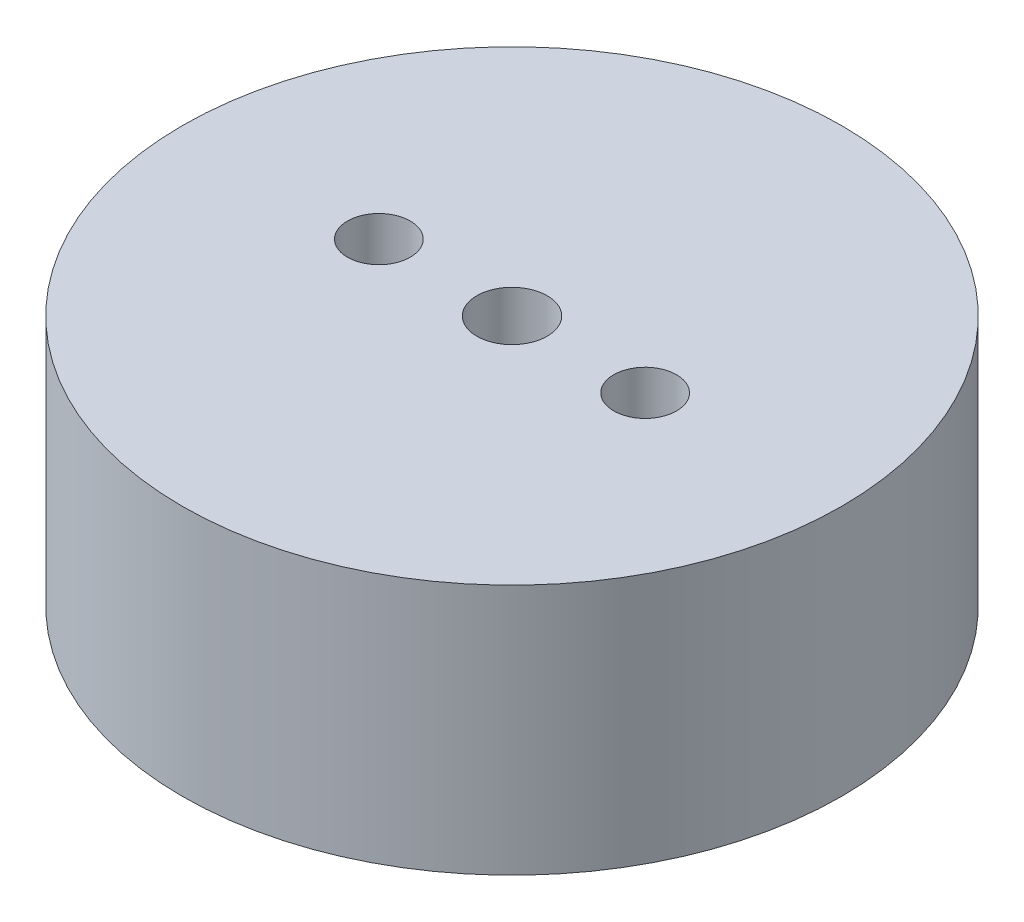
ISO-10303-21;
HEADER;
FILE_DESCRIPTION(('STEP AP214'),'2;1');
FILE_NAME('part.step','',(''),(''),'','','');
FILE_SCHEMA(('AUTOMOTIVE_DESIGN { 1 0 10303 214 1 1 1 1 }'));
ENDSEC;
DATA;
#1=APPLICATION_CONTEXT('core data for automotive mechanical design processes');
#2=APPLICATION_PROTOCOL_DEFINITION('international standard','automotive_design',2000,#1);
#3=PRODUCT_CONTEXT('',#1,'mechanical');
#4=PRODUCT('Part','Part','',(#3));
#5=PRODUCT_RELATED_PRODUCT_CATEGORY('part','',(#4));
#6=PRODUCT_DEFINITION_FORMATION('','',#4);
#7=PRODUCT_DEFINITION_CONTEXT('part definition',#1,'design');
#8=PRODUCT_DEFINITION('design','',#6,#7);
#9=PRODUCT_DEFINITION_SHAPE('','',#8);
#10=(LENGTH_UNIT() NAMED_UNIT(*) SI_UNIT(.MILLI.,.METRE.));
#11=(NAMED_UNIT(*) PLANE_ANGLE_UNIT() SI_UNIT($,.RADIAN.));
#12=(NAMED_UNIT(*) SI_UNIT($,.STERADIAN.) SOLID_ANGLE_UNIT());
#13=UNCERTAINTY_MEASURE_WITH_UNIT(LENGTH_MEASURE(1.E-05),#10,'distance_accuracy_value','');
#14=(GEOMETRIC_REPRESENTATION_CONTEXT(3) GLOBAL_UNCERTAINTY_ASSIGNED_CONTEXT((#13)) GLOBAL_UNIT_ASSIGNED_CONTEXT((#10,
#11,#12)) REPRESENTATION_CONTEXT('',''));
#15=CARTESIAN_POINT('',(0.,0.,0.));
#16=DIRECTION('',(0.,0.,1.));
#17=DIRECTION('',(1.,0.,0.));
#18=AXIS2_PLACEMENT_3D('',#15,#16,#17);
#19=CARTESIAN_POINT('',(0.,25.4,0.));
#20=DIRECTION('',(0.,-1.,0.));
#21=DIRECTION('',(0.,0.,-1.));
#22=AXIS2_PLACEMENT_3D('',#19,#20,#21);
#23=CYLINDRICAL_SURFACE('',#22,33.3375);
#24=CARTESIAN_POINT('',(0.,25.4,0.));
#25=DIRECTION('',(0.,1.,0.));
#26=DIRECTION('',(0.,0.,1.));
#27=AXIS2_PLACEMENT_3D('',#24,#25,#26);
#28=CIRCLE('',#27,33.3375);
#29=CARTESIAN_POINT('',(0.,25.4,33.3375));
#30=VERTEX_POINT('',#29);
#31=EDGE_CURVE('E10',#30,#30,#28,.T.);
#32=ORIENTED_EDGE('',*,*,#31,.F.);
#33=EDGE_LOOP('',(#32));
#34=FACE_BOUND('',#33,.T.);
#35=CARTESIAN_POINT('',(0.,0.,0.));
#36=DIRECTION('',(0.,1.,0.));
#37=DIRECTION('',(0.,0.,1.));
#38=AXIS2_PLACEMENT_3D('',#35,#36,#37);
#39=CIRCLE('',#38,33.3375);
#40=CARTESIAN_POINT('',(0.,0.,33.3375));
#41=VERTEX_POINT('',#40);
#42=EDGE_CURVE('E35',#41,#41,#39,.T.);
#43=ORIENTED_EDGE('',*,*,#42,.T.);
#44=EDGE_LOOP('',(#43));
#45=FACE_BOUND('',#44,.T.);
#46=ADVANCED_FACE('F32',(#34,#45),#23,.T.);
#47=CARTESIAN_POINT('',(0.,25.4,0.));
#48=DIRECTION('',(0.,1.,0.));
#49=DIRECTION('',(0.,0.,1.));
#50=AXIS2_PLACEMENT_3D('',#47,#48,#49);
#51=PLANE('',#50);
#52=CARTESIAN_POINT('',(-13.462,25.4,0.));
#53=DIRECTION('',(0.,1.,0.));
#54=DIRECTION('',(0.,0.,1.));
#55=AXIS2_PLACEMENT_3D('',#52,#53,#54);
#56=CIRCLE('',#55,3.175);
#57=CARTESIAN_POINT('',(-13.462,25.4,3.175));
#58=VERTEX_POINT('',#57);
#59=EDGE_CURVE('E56',#58,#58,#56,.T.);
#60=ORIENTED_EDGE('',*,*,#59,.F.);
#61=EDGE_LOOP('',(#60));
#62=FACE_BOUND('',#61,.T.);
#63=CARTESIAN_POINT('',(13.462,25.4,0.));
#64=DIRECTION('',(0.,1.,0.));
#65=DIRECTION('',(0.,0.,-1.));
#66=AXIS2_PLACEMENT_3D('',#63,#64,#65);
#67=CIRCLE('',#66,3.175);
#68=CARTESIAN_POINT('',(13.462,25.4,-3.175));
#69=VERTEX_POINT('',#68);
#70=EDGE_CURVE('E50',#69,#69,#67,.T.);
#71=ORIENTED_EDGE('',*,*,#70,.F.);
#72=EDGE_LOOP('',(#71));
#73=FACE_BOUND('',#72,.T.);
#74=CARTESIAN_POINT('',(0.,25.4,0.));
#75=DIRECTION('',(0.,1.,0.));
#76=DIRECTION('',(0.,0.,1.));
#77=AXIS2_PLACEMENT_3D('',#74,#75,#76);
#78=CIRCLE('',#77,3.556);
#79=CARTESIAN_POINT('',(0.,25.4,3.556));
#80=VERTEX_POINT('',#79);
#81=EDGE_CURVE('E44',#80,#80,#78,.T.);
#82=ORIENTED_EDGE('',*,*,#81,.F.);
#83=EDGE_LOOP('',(#82));
#84=FACE_BOUND('',#83,.T.);
#85=ORIENTED_EDGE('',*,*,#31,.T.);
#86=EDGE_LOOP('',(#85));
#87=FACE_BOUND('',#86,.T.);
#88=ADVANCED_FACE('F72',(#62,#73,#84,#87),#51,.T.);
#89=CARTESIAN_POINT('',(0.,0.,0.));
#90=DIRECTION('',(0.,1.,0.));
#91=DIRECTION('',(0.,0.,1.));
#92=AXIS2_PLACEMENT_3D('',#89,#90,#91);
#93=PLANE('',#92);
#94=CARTESIAN_POINT('',(-13.462,0.,0.));
#95=DIRECTION('',(0.,1.,0.));
#96=DIRECTION('',(0.,0.,1.));
#97=AXIS2_PLACEMENT_3D('',#94,#95,#96);
#98=CIRCLE('',#97,3.175);
#99=CARTESIAN_POINT('',(-13.462,0.,3.175));
#100=VERTEX_POINT('',#99);
#101=EDGE_CURVE('E47',#100,#100,#98,.T.);
#102=ORIENTED_EDGE('',*,*,#101,.T.);
#103=EDGE_LOOP('',(#102));
#104=FACE_BOUND('',#103,.T.);
#105=CARTESIAN_POINT('',(13.462,0.,0.));
#106=DIRECTION('',(0.,1.,0.));
#107=DIRECTION('',(0.,0.,-1.));
#108=AXIS2_PLACEMENT_3D('',#105,#106,#107);
#109=CIRCLE('',#108,3.175);
#110=CARTESIAN_POINT('',(13.462,0.,-3.175));
#111=VERTEX_POINT('',#110);
#112=EDGE_CURVE('E53',#111,#111,#109,.T.);
#113=ORIENTED_EDGE('',*,*,#112,.T.);
#114=EDGE_LOOP('',(#113));
#115=FACE_BOUND('',#114,.T.);
#116=CARTESIAN_POINT('',(0.,0.,0.));
#117=DIRECTION('',(0.,1.,0.));
#118=DIRECTION('',(0.,0.,1.));
#119=AXIS2_PLACEMENT_3D('',#116,#117,#118);
#120=CIRCLE('',#119,3.556);
#121=CARTESIAN_POINT('',(0.,0.,3.556));
#122=VERTEX_POINT('',#121);
#123=EDGE_CURVE('E42',#122,#122,#120,.T.);
#124=ORIENTED_EDGE('',*,*,#123,.T.);
#125=EDGE_LOOP('',(#124));
#126=FACE_BOUND('',#125,.T.);
#127=ORIENTED_EDGE('',*,*,#42,.F.);
#128=EDGE_LOOP('',(#127));
#129=FACE_BOUND('',#128,.T.);
#130=ADVANCED_FACE('F62',(#104,#115,#126,#129),#93,.F.);
#131=CARTESIAN_POINT('',(0.,0.,0.));
#132=DIRECTION('',(0.,1.,0.));
#133=DIRECTION('',(0.,0.,1.));
#134=AXIS2_PLACEMENT_3D('',#131,#132,#133);
#135=CYLINDRICAL_SURFACE('',#134,3.556);
#136=ORIENTED_EDGE('',*,*,#123,.F.);
#137=EDGE_LOOP('',(#136));
#138=FACE_BOUND('',#137,.T.);
#139=ORIENTED_EDGE('',*,*,#81,.T.);
#140=EDGE_LOOP('',(#139));
#141=FACE_BOUND('',#140,.T.);
#142=ADVANCED_FACE('F80',(#138,#141),#135,.F.);
#143=CARTESIAN_POINT('',(13.462,0.,0.));
#144=DIRECTION('',(0.,1.,0.));
#145=DIRECTION('',(0.,0.,1.));
#146=AXIS2_PLACEMENT_3D('',#143,#144,#145);
#147=CYLINDRICAL_SURFACE('',#146,3.175);
#148=ORIENTED_EDGE('',*,*,#112,.F.);
#149=EDGE_LOOP('',(#148));
#150=FACE_BOUND('',#149,.T.);
#151=ORIENTED_EDGE('',*,*,#70,.T.);
#152=EDGE_LOOP('',(#151));
#153=FACE_BOUND('',#152,.T.);
#154=ADVANCED_FACE('F68',(#150,#153),#147,.F.);
#155=CARTESIAN_POINT('',(-13.462,0.,0.));
#156=DIRECTION('',(0.,1.,0.));
#157=DIRECTION('',(0.,0.,1.));
#158=AXIS2_PLACEMENT_3D('',#155,#156,#157);
#159=CYLINDRICAL_SURFACE('',#158,3.175);
#160=ORIENTED_EDGE('',*,*,#101,.F.);
#161=EDGE_LOOP('',(#160));
#162=FACE_BOUND('',#161,.T.);
#163=ORIENTED_EDGE('',*,*,#59,.T.);
#164=EDGE_LOOP('',(#163));
#165=FACE_BOUND('',#164,.T.);
#166=ADVANCED_FACE('F65',(#162,#165),#159,.F.);
#167=CLOSED_SHELL('',(#46,#88,#130,#142,#154,#166));
#168=MANIFOLD_SOLID_BREP('B2',#167);
#169=ADVANCED_BREP_SHAPE_REPRESENTATION('',(#18,#168),#14);
#170=SHAPE_DEFINITION_REPRESENTATION(#9,#169);
ENDSEC;
END-ISO-10303-21;
